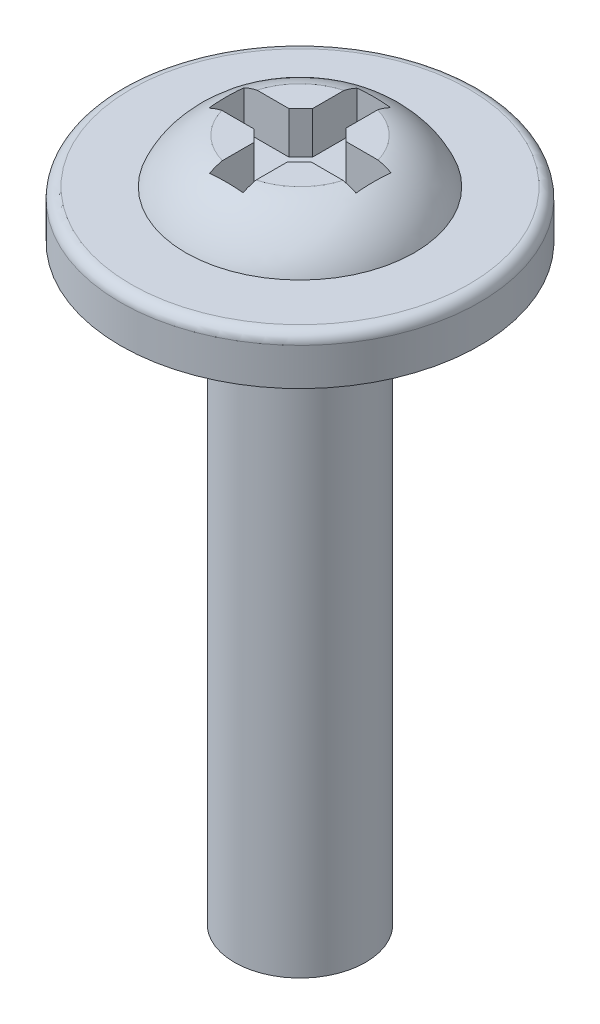
ISO-10303-21;
HEADER;
FILE_DESCRIPTION(('STEP AP214'),'2;1');
FILE_NAME('part.step','',(''),(''),'','','');
FILE_SCHEMA(('AUTOMOTIVE_DESIGN { 1 0 10303 214 1 1 1 1 }'));
ENDSEC;
DATA;
#1=APPLICATION_CONTEXT('core data for automotive mechanical design processes');
#2=APPLICATION_PROTOCOL_DEFINITION('international standard','automotive_design',2000,#1);
#3=PRODUCT_CONTEXT('',#1,'mechanical');
#4=PRODUCT('Part','Part','',(#3));
#5=PRODUCT_RELATED_PRODUCT_CATEGORY('part','',(#4));
#6=PRODUCT_DEFINITION_FORMATION('','',#4);
#7=PRODUCT_DEFINITION_CONTEXT('part definition',#1,'design');
#8=PRODUCT_DEFINITION('design','',#6,#7);
#9=PRODUCT_DEFINITION_SHAPE('','',#8);
#10=(LENGTH_UNIT() NAMED_UNIT(*) SI_UNIT(.MILLI.,.METRE.));
#11=(NAMED_UNIT(*) PLANE_ANGLE_UNIT() SI_UNIT($,.RADIAN.));
#12=(NAMED_UNIT(*) SI_UNIT($,.STERADIAN.) SOLID_ANGLE_UNIT());
#13=UNCERTAINTY_MEASURE_WITH_UNIT(LENGTH_MEASURE(1.E-05),#10,'distance_accuracy_value','');
#14=(GEOMETRIC_REPRESENTATION_CONTEXT(3) GLOBAL_UNCERTAINTY_ASSIGNED_CONTEXT((#13)) GLOBAL_UNIT_ASSIGNED_CONTEXT((#10,
#11,#12)) REPRESENTATION_CONTEXT('',''));
#15=CARTESIAN_POINT('',(0.,0.,0.));
#16=DIRECTION('',(0.,0.,1.));
#17=DIRECTION('',(1.,0.,0.));
#18=AXIS2_PLACEMENT_3D('',#15,#16,#17);
#19=CARTESIAN_POINT('',(0.,15.494,-1.905));
#20=CARTESIAN_POINT('',(0.,15.3632015750618,-2.48585998432291));
#21=CARTESIAN_POINT('',(0.,14.8318441823324,-3.16981228226771));
#22=CARTESIAN_POINT('',(0.,14.1478,-3.4544));
#23=B_SPLINE_CURVE_WITH_KNOTS('',3,(#19,#20,#21,#22),.UNSPECIFIED.,.F.,.F.,(4,4),(0.,1.),.UNSPECIFIED.);
#24=CARTESIAN_POINT('',(0.,0.,0.));
#25=DIRECTION('',(0.,-1.,0.));
#26=AXIS1_PLACEMENT('',#24,#25);
#27=SURFACE_OF_REVOLUTION('',#23,#26);
#28=CARTESIAN_POINT('',(0.,14.1478,0.));
#29=DIRECTION('',(0.,-1.,0.));
#30=DIRECTION('',(0.,0.,-1.));
#31=AXIS2_PLACEMENT_3D('',#28,#29,#30);
#32=CIRCLE('',#31,3.4544);
#33=CARTESIAN_POINT('',(0.,14.1478,-3.4544));
#34=VERTEX_POINT('',#33);
#35=EDGE_CURVE('E326',#34,#34,#32,.T.);
#36=ORIENTED_EDGE('',*,*,#35,.F.);
#37=EDGE_LOOP('',(#36));
#38=FACE_BOUND('',#37,.T.);
#39=CARTESIAN_POINT('',(-2.22356907078531,15.3579806541294,0.530600214329885));
#40=CARTESIAN_POINT('',(-2.20251859517428,15.3678587523332,0.530600214329887));
#41=CARTESIAN_POINT('',(-2.18130915061745,15.3774012520256,0.530600214329888));
#42=CARTESIAN_POINT('',(-2.13863931356944,15.3957450113185,0.530600214329889));
#43=CARTESIAN_POINT('',(-2.11717974075077,15.4045481790477,0.530600214329889));
#44=CARTESIAN_POINT('',(-2.07399660062318,15.4213837822004,0.530600214329889));
#45=CARTESIAN_POINT('',(-2.05227347592328,15.4294173501357,0.530600214329889));
#46=CARTESIAN_POINT('',(-2.00853950348615,15.444676522205,0.530600214329889));
#47=CARTESIAN_POINT('',(-1.98652859427027,15.4519019504412,0.530600214329889));
#48=CARTESIAN_POINT('',(-1.94221027994457,15.4654909301265,0.530600214329889));
#49=CARTESIAN_POINT('',(-1.91990253137907,15.471853366522,0.530600214329889));
#50=CARTESIAN_POINT('',(-1.87497312131895,15.4836498718535,0.530600214329889));
#51=CARTESIAN_POINT('',(-1.85235072870513,15.4890811509238,0.530600214329888));
#52=CARTESIAN_POINT('',(-1.82961427971938,15.494,0.530600214329888));
#53=B_SPLINE_CURVE_WITH_KNOTS('',3,(#39,#40,#41,#42,#43,#44,#45,#46,#47,#48,#49,#50,#51,#52),
.UNSPECIFIED.,.F.,.F.,(4,2,2,2,2,2,4),(0.,0.0697578375622903,0.139329720273001,
0.208797598407412,0.278280567461784,0.347852475761829,0.417629319570374),.UNSPECIFIED.);
#54=CARTESIAN_POINT('',(-2.22356907078532,15.3579806541294,0.530600214329889));
#55=VERTEX_POINT('',#54);
#56=CARTESIAN_POINT('',(-1.82961427971938,15.494,0.530600214329889));
#57=VERTEX_POINT('',#56);
#58=EDGE_CURVE('E321',#55,#57,#53,.T.);
#59=ORIENTED_EDGE('',*,*,#58,.F.);
#60=CARTESIAN_POINT('',(-2.22356907078531,15.3579806541294,0.530600214329885));
#61=CARTESIAN_POINT('',(-2.22356907078531,15.3629217206207,0.486453609451828));
#62=CARTESIAN_POINT('',(-2.22356907078532,15.3671912887825,0.442233933670321));
#63=CARTESIAN_POINT('',(-2.22356907078532,15.3744390617582,0.353789726310259));
#64=CARTESIAN_POINT('',(-2.22356907078532,15.3774201786407,0.309565434046432));
#65=CARTESIAN_POINT('',(-2.22356907078532,15.3821611274982,0.221116816199245));
#66=CARTESIAN_POINT('',(-2.22356907078532,15.3839227335333,0.176892584649752));
#67=CARTESIAN_POINT('',(-2.22356907078532,15.3862658832774,0.0884455535069007));
#68=CARTESIAN_POINT('',(-2.22356907078532,15.3868482934057,0.0442227767534489));
#69=CARTESIAN_POINT('',(-2.22356907078532,15.3868482934057,-0.0442227767534546));
#70=CARTESIAN_POINT('',(-2.22356907078532,15.3862658832774,-0.0884455535069062));
#71=CARTESIAN_POINT('',(-2.22356907078532,15.3839227335333,-0.176892584649757));
#72=CARTESIAN_POINT('',(-2.22356907078532,15.3821611274982,-0.22111681619925));
#73=CARTESIAN_POINT('',(-2.22356907078532,15.3774201786407,-0.309565434046438));
#74=CARTESIAN_POINT('',(-2.22356907078532,15.3744390617582,-0.353789726310265));
#75=CARTESIAN_POINT('',(-2.22356907078532,15.3671912887825,-0.442233933670327));
#76=CARTESIAN_POINT('',(-2.22356907078532,15.3629217206207,-0.486453609451833));
#77=CARTESIAN_POINT('',(-2.22356907078532,15.3579806541294,-0.53060021432989));
#78=B_SPLINE_CURVE_WITH_KNOTS('',3,(#60,#61,#62,#63,#64,#65,#66,#67,#68,#69,#70,#71,#72,#73,#74,
#75,#76,#77),.UNSPECIFIED.,.F.,.F.,(4,2,2,2,2,2,2,2,4),(0.,0.133258583941941,0.266214390718466,
0.398976373822808,0.531640774033104,0.6643051742434,0.797067157347742,0.930022964124267,
1.06328154806621),.UNSPECIFIED.);
#79=CARTESIAN_POINT('',(-2.22356907078532,15.3579806541294,-0.53060021432989));
#80=VERTEX_POINT('',#79);
#81=EDGE_CURVE('E452',#55,#80,#78,.T.);
#82=ORIENTED_EDGE('',*,*,#81,.T.);
#83=CARTESIAN_POINT('',(-1.82961427971938,15.494,-0.530600214329889));
#84=CARTESIAN_POINT('',(-1.85235072870513,15.4890811509238,-0.53060021432989));
#85=CARTESIAN_POINT('',(-1.87497312131895,15.4836498718535,-0.53060021432989));
#86=CARTESIAN_POINT('',(-1.91990253137907,15.471853366522,-0.53060021432989));
#87=CARTESIAN_POINT('',(-1.94221027994457,15.4654909301265,-0.53060021432989));
#88=CARTESIAN_POINT('',(-1.98652859427027,15.4519019504412,-0.53060021432989));
#89=CARTESIAN_POINT('',(-2.00853950348615,15.444676522205,-0.53060021432989));
#90=CARTESIAN_POINT('',(-2.05227347592329,15.4294173501357,-0.53060021432989));
#91=CARTESIAN_POINT('',(-2.07399660062318,15.4213837822004,-0.53060021432989));
#92=CARTESIAN_POINT('',(-2.11717974075078,15.4045481790477,-0.53060021432989));
#93=CARTESIAN_POINT('',(-2.13863931356945,15.3957450113185,-0.53060021432989));
#94=CARTESIAN_POINT('',(-2.18130915061746,15.3774012520256,-0.53060021432989));
#95=CARTESIAN_POINT('',(-2.20251859517428,15.3678587523332,-0.53060021432989));
#96=CARTESIAN_POINT('',(-2.22356907078531,15.3579806541294,-0.53060021432989));
#97=B_SPLINE_CURVE_WITH_KNOTS('',3,(#83,#84,#85,#86,#87,#88,#89,#90,#91,#92,#93,#94,#95,#96),
.UNSPECIFIED.,.F.,.F.,(4,2,2,2,2,2,4),(0.,0.0697768438085465,0.139348752108593,
0.208831721162967,0.278299599297379,0.347871482008091,0.417629319570382),.UNSPECIFIED.);
#98=CARTESIAN_POINT('',(-1.82961427971938,15.494,-0.53060021432989));
#99=VERTEX_POINT('',#98);
#100=EDGE_CURVE('E327',#99,#80,#97,.T.);
#101=ORIENTED_EDGE('',*,*,#100,.F.);
#102=CARTESIAN_POINT('',(0.,15.494,0.));
#103=DIRECTION('',(0.,-1.,0.));
#104=DIRECTION('',(0.,0.,-1.));
#105=AXIS2_PLACEMENT_3D('',#102,#103,#104);
#106=CIRCLE('',#105,1.905);
#107=CARTESIAN_POINT('',(-0.508,15.494,-1.83601770143972));
#108=VERTEX_POINT('',#107);
#109=EDGE_CURVE('E351',#99,#108,#106,.T.);
#110=ORIENTED_EDGE('',*,*,#109,.T.);
#111=CARTESIAN_POINT('',(-0.508,15.494,-1.83601770143972));
#112=CARTESIAN_POINT('',(-0.508,15.4890772866622,-1.85869246368517));
#113=CARTESIAN_POINT('',(-0.508,15.4836422043337,-1.88125275403726));
#114=CARTESIAN_POINT('',(-0.508,15.4718389300687,-1.92605738722141));
#115=CARTESIAN_POINT('',(-0.508,15.4654735312133,-1.94830246446108));
#116=CARTESIAN_POINT('',(-0.508,15.4518800967263,-1.99249509073534));
#117=CARTESIAN_POINT('',(-0.508,15.4446531747896,-2.01444298391082));
#118=CARTESIAN_POINT('',(-0.508,15.4293929072072,-2.0580506972434));
#119=CARTESIAN_POINT('',(-0.508,15.4213597390474,-2.07971057961896));
#120=CARTESIAN_POINT('',(-0.508,15.4045270887022,-2.12276723828017));
#121=CARTESIAN_POINT('',(-0.508,15.3957264749622,-2.14416357110202));
#122=CARTESIAN_POINT('',(-0.508,15.3773901687989,-2.18670705080968));
#123=CARTESIAN_POINT('',(-0.508,15.3678525726132,-2.20785337780709));
#124=CARTESIAN_POINT('',(-0.508,15.3579806541294,-2.22884095439759));
#125=B_SPLINE_CURVE_WITH_KNOTS('',3,(#111,#112,#113,#114,#115,#116,#117,#118,#119,#120,#121,
#122,#123,#124),.UNSPECIFIED.,.F.,.F.,(4,2,2,2,2,2,4),(0.,0.0695983658431737,0.138991913436484,
0.208296709070973,0.277586281379517,0.34697980281484,0.416558992350354),.UNSPECIFIED.);
#126=CARTESIAN_POINT('',(-0.508,15.3579806541294,-2.2288409543976));
#127=VERTEX_POINT('',#126);
#128=EDGE_CURVE('E415',#108,#127,#125,.T.);
#129=ORIENTED_EDGE('',*,*,#128,.T.);
#130=CARTESIAN_POINT('',(0.508000000000002,15.3579806541294,-2.22884095439759));
#131=CARTESIAN_POINT('',(0.465727683927626,15.3625105562352,-2.22884095439759));
#132=CARTESIAN_POINT('',(0.423391520364505,15.3664290641181,-2.2288409543976));
#133=CARTESIAN_POINT('',(0.338715286841423,15.3730865747813,-2.2288409543976));
#134=CARTESIAN_POINT('',(0.296375409730574,15.3758280240421,-2.2288409543976));
#135=CARTESIAN_POINT('',(0.211695632434225,15.3801902643877,-2.2288409543976));
#136=CARTESIAN_POINT('',(0.169355808841702,15.3818125574861,-2.2288409543976));
#137=CARTESIAN_POINT('',(0.0846773110622564,15.3839708839213,-2.2288409543976));
#138=CARTESIAN_POINT('',(0.0423386555311298,15.3845076524597,-2.2288409543976));
#139=CARTESIAN_POINT('',(-0.0423386555311236,15.3845076524598,-2.2288409543976));
#140=CARTESIAN_POINT('',(-0.0846773110622504,15.3839708839213,-2.2288409543976));
#141=CARTESIAN_POINT('',(-0.169355808841696,15.3818125574861,-2.2288409543976));
#142=CARTESIAN_POINT('',(-0.211695632434219,15.3801902643877,-2.2288409543976));
#143=CARTESIAN_POINT('',(-0.296375409730568,15.3758280240421,-2.2288409543976));
#144=CARTESIAN_POINT('',(-0.338715286841417,15.3730865747813,-2.2288409543976));
#145=CARTESIAN_POINT('',(-0.4233915203645,15.3664290641181,-2.2288409543976));
#146=CARTESIAN_POINT('',(-0.46572768392762,15.3625105562352,-2.2288409543976));
#147=CARTESIAN_POINT('',(-0.507999999999994,15.3579806541294,-2.2288409543976));
#148=B_SPLINE_CURVE_WITH_KNOTS('',3,(#130,#131,#132,#133,#134,#135,#136,#137,#138,#139,#140,
#141,#142,#143,#144,#145,#146,#147),.UNSPECIFIED.,.F.,.F.,(4,2,2,2,2,2,2,2,4),(0.,
0.127536118282588,0.254805858077294,0.381904455774846,0.50891694354961,0.635929431324374,
0.763028029021926,0.890297768816631,1.01783388709922),.UNSPECIFIED.);
#149=CARTESIAN_POINT('',(0.508,15.3579806541294,-2.2288409543976));
#150=VERTEX_POINT('',#149);
#151=EDGE_CURVE('E378',#150,#127,#148,.T.);
#152=ORIENTED_EDGE('',*,*,#151,.F.);
#153=CARTESIAN_POINT('',(0.508000000000002,15.3579806541294,-2.22884095439759));
#154=CARTESIAN_POINT('',(0.508000000000001,15.3678525726132,-2.20785337780708));
#155=CARTESIAN_POINT('',(0.508,15.3773901687989,-2.18670705080967));
#156=CARTESIAN_POINT('',(0.508,15.3957264749622,-2.14416357110202));
#157=CARTESIAN_POINT('',(0.508,15.4045270887022,-2.12276723828016));
#158=CARTESIAN_POINT('',(0.508,15.4213597390474,-2.07971057961895));
#159=CARTESIAN_POINT('',(0.508,15.4293929072072,-2.0580506972434));
#160=CARTESIAN_POINT('',(0.508,15.4446531747896,-2.01444298391082));
#161=CARTESIAN_POINT('',(0.508,15.4518800967263,-1.99249509073534));
#162=CARTESIAN_POINT('',(0.508,15.4654735312133,-1.94830246446108));
#163=CARTESIAN_POINT('',(0.508,15.4718389300687,-1.92605738722141));
#164=CARTESIAN_POINT('',(0.508,15.4836422043337,-1.88125275403726));
#165=CARTESIAN_POINT('',(0.508,15.4890772866622,-1.85869246368517));
#166=CARTESIAN_POINT('',(0.508,15.494,-1.83601770143972));
#167=B_SPLINE_CURVE_WITH_KNOTS('',3,(#153,#154,#155,#156,#157,#158,#159,#160,#161,#162,#163,
#164,#165,#166),.UNSPECIFIED.,.F.,.F.,(4,2,2,2,2,2,4),(0.,0.0695791895355102,0.138972710970831,
0.208262283279374,0.277567078913863,0.346960626507172,0.416558992350344),.UNSPECIFIED.);
#168=CARTESIAN_POINT('',(0.508,15.494,-1.83601770143972));
#169=VERTEX_POINT('',#168);
#170=EDGE_CURVE('E409',#150,#169,#167,.T.);
#171=ORIENTED_EDGE('',*,*,#170,.T.);
#172=CARTESIAN_POINT('',(1.82961427971938,15.494,-0.53060021432989));
#173=VERTEX_POINT('',#172);
#174=EDGE_CURVE('E352',#169,#173,#106,.T.);
#175=ORIENTED_EDGE('',*,*,#174,.T.);
#176=CARTESIAN_POINT('',(2.22356907078532,15.3579806541294,-0.53060021432989));
#177=CARTESIAN_POINT('',(2.20251859517428,15.3678587523332,-0.53060021432989));
#178=CARTESIAN_POINT('',(2.18130915061746,15.3774012520256,-0.53060021432989));
#179=CARTESIAN_POINT('',(2.13863931356945,15.3957450113185,-0.53060021432989));
#180=CARTESIAN_POINT('',(2.11717974075078,15.4045481790477,-0.53060021432989));
#181=CARTESIAN_POINT('',(2.07399660062318,15.4213837822004,-0.53060021432989));
#182=CARTESIAN_POINT('',(2.05227347592329,15.4294173501357,-0.53060021432989));
#183=CARTESIAN_POINT('',(2.00853950348615,15.444676522205,-0.53060021432989));
#184=CARTESIAN_POINT('',(1.98652859427028,15.4519019504412,-0.53060021432989));
#185=CARTESIAN_POINT('',(1.94221027994457,15.4654909301265,-0.53060021432989));
#186=CARTESIAN_POINT('',(1.91990253137907,15.471853366522,-0.53060021432989));
#187=CARTESIAN_POINT('',(1.87497312131895,15.4836498718535,-0.53060021432989));
#188=CARTESIAN_POINT('',(1.85235072870513,15.4890811509238,-0.53060021432989));
#189=CARTESIAN_POINT('',(1.82961427971938,15.494,-0.53060021432989));
#190=B_SPLINE_CURVE_WITH_KNOTS('',3,(#176,#177,#178,#179,#180,#181,#182,#183,#184,#185,#186,
#187,#188,#189),.UNSPECIFIED.,.F.,.F.,(4,2,2,2,2,2,4),(0.,0.0697578375622914,0.139329720273005,
0.208797598407417,0.278280567461791,0.347852475761837,0.417629319570385),.UNSPECIFIED.);
#191=CARTESIAN_POINT('',(2.22356907078532,15.3579806541294,-0.53060021432989));
#192=VERTEX_POINT('',#191);
#193=EDGE_CURVE('E404',#192,#173,#190,.T.);
#194=ORIENTED_EDGE('',*,*,#193,.F.);
#195=CARTESIAN_POINT('',(2.22356907078531,15.3579806541294,0.530600214329891));
#196=CARTESIAN_POINT('',(2.22356907078532,15.3629217206207,0.486453609451833));
#197=CARTESIAN_POINT('',(2.22356907078532,15.3671912887825,0.442233933670326));
#198=CARTESIAN_POINT('',(2.22356907078532,15.3744390617582,0.353789726310263));
#199=CARTESIAN_POINT('',(2.22356907078532,15.3774201786407,0.309565434046436));
#200=CARTESIAN_POINT('',(2.22356907078532,15.3821611274982,0.221116816199248));
#201=CARTESIAN_POINT('',(2.22356907078532,15.3839227335333,0.176892584649755));
#202=CARTESIAN_POINT('',(2.22356907078532,15.3862658832774,0.0884455535069037));
#203=CARTESIAN_POINT('',(2.22356907078532,15.3868482934057,0.0442227767534516));
#204=CARTESIAN_POINT('',(2.22356907078532,15.3868482934057,-0.0442227767534523));
#205=CARTESIAN_POINT('',(2.22356907078532,15.3862658832774,-0.0884455535069043));
#206=CARTESIAN_POINT('',(2.22356907078532,15.3839227335333,-0.176892584649756));
#207=CARTESIAN_POINT('',(2.22356907078532,15.3821611274982,-0.221116816199249));
#208=CARTESIAN_POINT('',(2.22356907078532,15.3774201786407,-0.309565434046437));
#209=CARTESIAN_POINT('',(2.22356907078532,15.3744390617582,-0.353789726310264));
#210=CARTESIAN_POINT('',(2.22356907078532,15.3671912887825,-0.442233933670327));
#211=CARTESIAN_POINT('',(2.22356907078532,15.3629217206207,-0.486453609451833));
#212=CARTESIAN_POINT('',(2.22356907078532,15.3579806541294,-0.530600214329891));
#213=B_SPLINE_CURVE_WITH_KNOTS('',3,(#195,#196,#197,#198,#199,#200,#201,#202,#203,#204,#205,
#206,#207,#208,#209,#210,#211,#212),.UNSPECIFIED.,.F.,.F.,(4,2,2,2,2,2,2,2,4),(0.,
0.133258583941942,0.266214390718467,0.39897637382281,0.531640774033107,0.664305174243404,
0.797067157347747,0.930022964124273,1.06328154806621),.UNSPECIFIED.);
#214=CARTESIAN_POINT('',(2.22356907078532,15.3579806541294,0.530600214329889));
#215=VERTEX_POINT('',#214);
#216=EDGE_CURVE('E372',#215,#192,#213,.T.);
#217=ORIENTED_EDGE('',*,*,#216,.F.);
#218=CARTESIAN_POINT('',(1.82961427971938,15.494,0.530600214329889));
#219=CARTESIAN_POINT('',(1.85235072870513,15.4890811509238,0.530600214329889));
#220=CARTESIAN_POINT('',(1.87497312131895,15.4836498718535,0.530600214329889));
#221=CARTESIAN_POINT('',(1.91990253137907,15.471853366522,0.530600214329889));
#222=CARTESIAN_POINT('',(1.94221027994457,15.4654909301265,0.530600214329889));
#223=CARTESIAN_POINT('',(1.98652859427027,15.4519019504412,0.530600214329889));
#224=CARTESIAN_POINT('',(2.00853950348615,15.444676522205,0.530600214329889));
#225=CARTESIAN_POINT('',(2.05227347592329,15.4294173501357,0.530600214329889));
#226=CARTESIAN_POINT('',(2.07399660062318,15.4213837822004,0.530600214329889));
#227=CARTESIAN_POINT('',(2.11717974075077,15.4045481790477,0.530600214329889));
#228=CARTESIAN_POINT('',(2.13863931356945,15.3957450113185,0.530600214329889));
#229=CARTESIAN_POINT('',(2.18130915061746,15.3774012520256,0.530600214329889));
#230=CARTESIAN_POINT('',(2.20251859517428,15.3678587523332,0.530600214329889));
#231=CARTESIAN_POINT('',(2.22356907078531,15.3579806541294,0.530600214329888));
#232=B_SPLINE_CURVE_WITH_KNOTS('',3,(#218,#219,#220,#221,#222,#223,#224,#225,#226,#227,#228,
#229,#230,#231),.UNSPECIFIED.,.F.,.F.,(4,2,2,2,2,2,4),(0.,0.0697768438085463,0.139348752108592,
0.208831721162967,0.278299599297378,0.34787148200809,0.417629319570382),.UNSPECIFIED.);
#233=CARTESIAN_POINT('',(1.82961427971938,15.494,0.530600214329889));
#234=VERTEX_POINT('',#233);
#235=EDGE_CURVE('E399',#234,#215,#232,.T.);
#236=ORIENTED_EDGE('',*,*,#235,.F.);
#237=CARTESIAN_POINT('',(0.508,15.494,1.83601770143972));
#238=VERTEX_POINT('',#237);
#239=EDGE_CURVE('E356',#234,#238,#106,.T.);
#240=ORIENTED_EDGE('',*,*,#239,.T.);
#241=CARTESIAN_POINT('',(0.508,15.494,1.83601770143972));
#242=CARTESIAN_POINT('',(0.508,15.4890772866622,1.85869246368517));
#243=CARTESIAN_POINT('',(0.508,15.4836422043337,1.88125275403727));
#244=CARTESIAN_POINT('',(0.508,15.4718389300687,1.92605738722141));
#245=CARTESIAN_POINT('',(0.508,15.4654735312133,1.94830246446108));
#246=CARTESIAN_POINT('',(0.508,15.4518800967263,1.99249509073535));
#247=CARTESIAN_POINT('',(0.508,15.4446531747896,2.01444298391083));
#248=CARTESIAN_POINT('',(0.508,15.4293929072072,2.05805069724341));
#249=CARTESIAN_POINT('',(0.508,15.4213597390474,2.07971057961897));
#250=CARTESIAN_POINT('',(0.508,15.4045270887022,2.12276723828018));
#251=CARTESIAN_POINT('',(0.508,15.3957264749622,2.14416357110203));
#252=CARTESIAN_POINT('',(0.508,15.3773901687989,2.18670705080969));
#253=CARTESIAN_POINT('',(0.508,15.3678525726132,2.20785337780709));
#254=CARTESIAN_POINT('',(0.508,15.3579806541294,2.2288409543976));
#255=B_SPLINE_CURVE_WITH_KNOTS('',3,(#241,#242,#243,#244,#245,#246,#247,#248,#249,#250,#251,
#252,#253,#254),.UNSPECIFIED.,.F.,.F.,(4,2,2,2,2,2,4),(0.,0.0695983658431761,0.138991913436488,
0.20829670907098,0.277586281379526,0.346979802814851,0.416558992350367),.UNSPECIFIED.);
#256=CARTESIAN_POINT('',(0.508,15.3579806541294,2.2288409543976));
#257=VERTEX_POINT('',#256);
#258=EDGE_CURVE('E292',#238,#257,#255,.T.);
#259=ORIENTED_EDGE('',*,*,#258,.T.);
#260=CARTESIAN_POINT('',(0.508,15.3579806541294,2.2288409543976));
#261=CARTESIAN_POINT('',(0.465727683927625,15.3625105562352,2.2288409543976));
#262=CARTESIAN_POINT('',(0.423391520364505,15.3664290641181,2.2288409543976));
#263=CARTESIAN_POINT('',(0.338715286841422,15.3730865747813,2.2288409543976));
#264=CARTESIAN_POINT('',(0.296375409730572,15.3758280240421,2.2288409543976));
#265=CARTESIAN_POINT('',(0.211695632434223,15.3801902643877,2.2288409543976));
#266=CARTESIAN_POINT('',(0.1693558088417,15.3818125574861,2.2288409543976));
#267=CARTESIAN_POINT('',(0.084677311062254,15.3839708839213,2.2288409543976));
#268=CARTESIAN_POINT('',(0.0423386555311271,15.3845076524597,2.2288409543976));
#269=CARTESIAN_POINT('',(-0.0423386555311267,15.3845076524597,2.2288409543976));
#270=CARTESIAN_POINT('',(-0.0846773110622536,15.3839708839213,2.2288409543976));
#271=CARTESIAN_POINT('',(-0.1693558088417,15.3818125574861,2.2288409543976));
#272=CARTESIAN_POINT('',(-0.211695632434222,15.3801902643877,2.2288409543976));
#273=CARTESIAN_POINT('',(-0.296375409730572,15.3758280240421,2.2288409543976));
#274=CARTESIAN_POINT('',(-0.338715286841421,15.3730865747813,2.2288409543976));
#275=CARTESIAN_POINT('',(-0.423391520364504,15.3664290641181,2.2288409543976));
#276=CARTESIAN_POINT('',(-0.465727683927625,15.3625105562352,2.2288409543976));
#277=CARTESIAN_POINT('',(-0.508,15.3579806541294,2.2288409543976));
#278=B_SPLINE_CURVE_WITH_KNOTS('',3,(#260,#261,#262,#263,#264,#265,#266,#267,#268,#269,#270,
#271,#272,#273,#274,#275,#276,#277),.UNSPECIFIED.,.F.,.F.,(4,2,2,2,2,2,2,2,4),(0.,
0.127536118282589,0.254805858077296,0.381904455774849,0.508916943549613,0.635929431324377,
0.76302802902193,0.890297768816636,1.01783388709923),.UNSPECIFIED.);
#279=CARTESIAN_POINT('',(-0.508,15.3579806541294,2.2288409543976));
#280=VERTEX_POINT('',#279);
#281=EDGE_CURVE('E366',#257,#280,#278,.T.);
#282=ORIENTED_EDGE('',*,*,#281,.T.);
#283=CARTESIAN_POINT('',(-0.508,15.3579806541294,2.2288409543976));
#284=CARTESIAN_POINT('',(-0.508,15.3678525726132,2.2078533778071));
#285=CARTESIAN_POINT('',(-0.508,15.3773901687989,2.18670705080969));
#286=CARTESIAN_POINT('',(-0.508,15.3957264749622,2.14416357110203));
#287=CARTESIAN_POINT('',(-0.508,15.4045270887022,2.12276723828017));
#288=CARTESIAN_POINT('',(-0.508,15.4213597390474,2.07971057961896));
#289=CARTESIAN_POINT('',(-0.508,15.4293929072072,2.05805069724341));
#290=CARTESIAN_POINT('',(-0.508,15.4446531747896,2.01444298391083));
#291=CARTESIAN_POINT('',(-0.508,15.4518800967263,1.99249509073535));
#292=CARTESIAN_POINT('',(-0.508,15.4654735312133,1.94830246446108));
#293=CARTESIAN_POINT('',(-0.508,15.4718389300687,1.92605738722141));
#294=CARTESIAN_POINT('',(-0.508,15.4836422043337,1.88125275403727));
#295=CARTESIAN_POINT('',(-0.508,15.4890772866622,1.85869246368517));
#296=CARTESIAN_POINT('',(-0.508,15.494,1.83601770143972));
#297=B_SPLINE_CURVE_WITH_KNOTS('',3,(#283,#284,#285,#286,#287,#288,#289,#290,#291,#292,#293,
#294,#295,#296),.UNSPECIFIED.,.F.,.F.,(4,2,2,2,2,2,4),(0.,0.0695791895355156,0.138972710970841,
0.208262283279386,0.277567078913878,0.34696062650719,0.416558992350366),.UNSPECIFIED.);
#298=CARTESIAN_POINT('',(-0.508,15.494,1.83601770143972));
#299=VERTEX_POINT('',#298);
#300=EDGE_CURVE('E249',#280,#299,#297,.T.);
#301=ORIENTED_EDGE('',*,*,#300,.T.);
#302=EDGE_CURVE('E454',#299,#57,#106,.T.);
#303=ORIENTED_EDGE('',*,*,#302,.T.);
#304=EDGE_LOOP('',(#59,#82,#101,#110,#129,#152,#171,#175,#194,#217,#236,#240,#259,#282,#301,#303));
#305=FACE_BOUND('',#304,.T.);
#306=ADVANCED_FACE('F37',(#38,#305),#27,.T.);
#307=CARTESIAN_POINT('',(0.,15.494,0.));
#308=DIRECTION('',(0.,-1.,0.));
#309=DIRECTION('',(0.,0.,-1.));
#310=AXIS2_PLACEMENT_3D('',#307,#308,#309);
#311=PLANE('',#310);
#312=DIRECTION('',(-1.,0.,0.));
#313=VECTOR('',#312,1.);
#314=CARTESIAN_POINT('',(0.,15.494,-0.53060021432989));
#315=LINE('',#314,#313);
#316=CARTESIAN_POINT('',(-0.861964761186199,15.494,-0.53060021432989));
#317=VERTEX_POINT('',#316);
#318=EDGE_CURVE('E364',#317,#99,#315,.T.);
#319=ORIENTED_EDGE('',*,*,#318,.F.);
#320=DIRECTION('',(0.707106781186539,0.,-0.707106781186557));
#321=VECTOR('',#320,1.);
#322=CARTESIAN_POINT('',(-0.696282487758055,15.494,-0.696282487758038));
#323=LINE('',#322,#321);
#324=CARTESIAN_POINT('',(-0.508,15.494,-0.884564975516098));
#325=VERTEX_POINT('',#324);
#326=EDGE_CURVE('E196',#317,#325,#323,.T.);
#327=ORIENTED_EDGE('',*,*,#326,.T.);
#328=DIRECTION('',(0.,0.,-1.));
#329=VECTOR('',#328,1.);
#330=CARTESIAN_POINT('',(-0.508,15.494,0.));
#331=LINE('',#330,#329);
#332=EDGE_CURVE('E361',#325,#108,#331,.T.);
#333=ORIENTED_EDGE('',*,*,#332,.T.);
#334=ORIENTED_EDGE('',*,*,#109,.F.);
#335=EDGE_LOOP('',(#319,#327,#333,#334));
#336=FACE_BOUND('',#335,.T.);
#337=ADVANCED_FACE('F438',(#336),#311,.F.);
#338=DIRECTION('',(1.,0.,0.));
#339=VECTOR('',#338,1.);
#340=CARTESIAN_POINT('',(0.,15.494,0.530600214329889));
#341=LINE('',#340,#339);
#342=CARTESIAN_POINT('',(0.861964761186181,15.494,0.530600214329889));
#343=VERTEX_POINT('',#342);
#344=EDGE_CURVE('E359',#343,#234,#341,.T.);
#345=ORIENTED_EDGE('',*,*,#344,.F.);
#346=DIRECTION('',(-0.707106781186539,0.,0.707106781186556));
#347=VECTOR('',#346,1.);
#348=CARTESIAN_POINT('',(0.696282487758045,15.494,0.696282487758028));
#349=LINE('',#348,#347);
#350=CARTESIAN_POINT('',(0.508,15.494,0.884564975516078));
#351=VERTEX_POINT('',#350);
#352=EDGE_CURVE('E237',#343,#351,#349,.T.);
#353=ORIENTED_EDGE('',*,*,#352,.T.);
#354=DIRECTION('',(0.,0.,1.));
#355=VECTOR('',#354,1.);
#356=CARTESIAN_POINT('',(0.508,15.494,0.));
#357=LINE('',#356,#355);
#358=EDGE_CURVE('E355',#351,#238,#357,.T.);
#359=ORIENTED_EDGE('',*,*,#358,.T.);
#360=ORIENTED_EDGE('',*,*,#239,.F.);
#361=EDGE_LOOP('',(#345,#353,#359,#360));
#362=FACE_BOUND('',#361,.T.);
#363=ADVANCED_FACE('F443',(#362),#311,.F.);
#364=DIRECTION('',(-1.,0.,0.));
#365=VECTOR('',#364,1.);
#366=CARTESIAN_POINT('',(0.,15.494,0.530600214329888));
#367=LINE('',#366,#365);
#368=CARTESIAN_POINT('',(-0.861964761186199,15.494,0.530600214329889));
#369=VERTEX_POINT('',#368);
#370=EDGE_CURVE('E52',#369,#57,#367,.T.);
#371=ORIENTED_EDGE('',*,*,#370,.T.);
#372=ORIENTED_EDGE('',*,*,#302,.F.);
#373=DIRECTION('',(0.,0.,1.));
#374=VECTOR('',#373,1.);
#375=CARTESIAN_POINT('',(-0.508,15.494,0.));
#376=LINE('',#375,#374);
#377=CARTESIAN_POINT('',(-0.508,15.494,0.884564975516078));
#378=VERTEX_POINT('',#377);
#379=EDGE_CURVE('E235',#378,#299,#376,.T.);
#380=ORIENTED_EDGE('',*,*,#379,.F.);
#381=DIRECTION('',(-0.707106781186557,0.,-0.707106781186539));
#382=VECTOR('',#381,1.);
#383=CARTESIAN_POINT('',(-0.696282487758033,15.494,0.696282487758051));
#384=LINE('',#383,#382);
#385=EDGE_CURVE('E233',#378,#369,#384,.T.);
#386=ORIENTED_EDGE('',*,*,#385,.T.);
#387=EDGE_LOOP('',(#371,#372,#380,#386));
#388=FACE_BOUND('',#387,.T.);
#389=ADVANCED_FACE('F456',(#388),#311,.F.);
#390=ORIENTED_EDGE('',*,*,#174,.F.);
#391=DIRECTION('',(0.,0.,-1.));
#392=VECTOR('',#391,1.);
#393=CARTESIAN_POINT('',(0.508,15.494,0.));
#394=LINE('',#393,#392);
#395=CARTESIAN_POINT('',(0.508,15.494,-0.884564975516098));
#396=VERTEX_POINT('',#395);
#397=EDGE_CURVE('E199',#396,#169,#394,.T.);
#398=ORIENTED_EDGE('',*,*,#397,.F.);
#399=DIRECTION('',(0.707106781186556,0.,0.707106781186539));
#400=VECTOR('',#399,1.);
#401=CARTESIAN_POINT('',(0.696282487758043,15.494,-0.69628248775806));
#402=LINE('',#401,#400);
#403=CARTESIAN_POINT('',(0.861964761186216,15.494,-0.53060021432989));
#404=VERTEX_POINT('',#403);
#405=EDGE_CURVE('E243',#396,#404,#402,.T.);
#406=ORIENTED_EDGE('',*,*,#405,.T.);
#407=DIRECTION('',(1.,0.,0.));
#408=VECTOR('',#407,1.);
#409=CARTESIAN_POINT('',(0.,15.494,-0.53060021432989));
#410=LINE('',#409,#408);
#411=EDGE_CURVE('E240',#404,#173,#410,.T.);
#412=ORIENTED_EDGE('',*,*,#411,.T.);
#413=EDGE_LOOP('',(#390,#398,#406,#412));
#414=FACE_BOUND('',#413,.T.);
#415=ADVANCED_FACE('F445',(#414),#311,.F.);
#416=CARTESIAN_POINT('',(0.,-5.15261801381829,0.));
#417=DIRECTION('',(0.,1.,0.));
#418=DIRECTION('',(0.,0.,1.));
#419=AXIS2_PLACEMENT_3D('',#416,#417,#418);
#420=CONICAL_SURFACE('',#419,1.9812,1.02716825384943);
#421=CARTESIAN_POINT('',(0.,-6.35,0.));
#422=VERTEX_POINT('',#421);
#423=VERTEX_LOOP('',#422);
#424=FACE_BOUND('',#423,.T.);
#425=CARTESIAN_POINT('',(0.,-5.15261801381829,0.));
#426=DIRECTION('',(0.,-1.,0.));
#427=DIRECTION('',(0.,0.,-1.));
#428=AXIS2_PLACEMENT_3D('',#425,#426,#427);
#429=CIRCLE('',#428,1.9812);
#430=CARTESIAN_POINT('',(0.,-5.15261801381829,-1.9812));
#431=VERTEX_POINT('',#430);
#432=EDGE_CURVE('E348',#431,#431,#429,.T.);
#433=ORIENTED_EDGE('',*,*,#432,.T.);
#434=EDGE_LOOP('',(#433));
#435=FACE_BOUND('',#434,.T.);
#436=ADVANCED_FACE('F524',(#424,#435),#420,.T.);
#437=CARTESIAN_POINT('',(0.,0.,0.));
#438=DIRECTION('',(0.,-1.,0.));
#439=DIRECTION('',(0.,0.,-1.));
#440=AXIS2_PLACEMENT_3D('',#437,#438,#439);
#441=CYLINDRICAL_SURFACE('',#440,1.9812);
#442=CARTESIAN_POINT('',(0.,12.7,0.));
#443=DIRECTION('',(0.,-1.,0.));
#444=DIRECTION('',(0.,0.,-1.));
#445=AXIS2_PLACEMENT_3D('',#442,#443,#444);
#446=CIRCLE('',#445,1.9812);
#447=CARTESIAN_POINT('',(0.,12.7,-1.9812));
#448=VERTEX_POINT('',#447);
#449=EDGE_CURVE('E345',#448,#448,#446,.T.);
#450=ORIENTED_EDGE('',*,*,#449,.T.);
#451=EDGE_LOOP('',(#450));
#452=FACE_BOUND('',#451,.T.);
#453=ORIENTED_EDGE('',*,*,#432,.F.);
#454=EDGE_LOOP('',(#453));
#455=FACE_BOUND('',#454,.T.);
#456=ADVANCED_FACE('F527',(#452,#455),#441,.T.);
#457=CARTESIAN_POINT('',(0.,12.7,0.));
#458=DIRECTION('',(0.,-1.,0.));
#459=DIRECTION('',(0.,0.,-1.));
#460=AXIS2_PLACEMENT_3D('',#457,#458,#459);
#461=PLANE('',#460);
#462=CARTESIAN_POINT('',(0.,12.7,0.));
#463=DIRECTION('',(0.,-1.,0.));
#464=DIRECTION('',(0.,0.,-1.));
#465=AXIS2_PLACEMENT_3D('',#462,#463,#464);
#466=CIRCLE('',#465,5.4229);
#467=CARTESIAN_POINT('',(0.,12.7,-5.4229));
#468=VERTEX_POINT('',#467);
#469=EDGE_CURVE('E342',#468,#468,#466,.T.);
#470=ORIENTED_EDGE('',*,*,#469,.T.);
#471=EDGE_LOOP('',(#470));
#472=FACE_BOUND('',#471,.T.);
#473=ORIENTED_EDGE('',*,*,#449,.F.);
#474=EDGE_LOOP('',(#473));
#475=FACE_BOUND('',#474,.T.);
#476=ADVANCED_FACE('F530',(#472,#475),#461,.T.);
#477=CARTESIAN_POINT('',(0.,0.,0.));
#478=DIRECTION('',(0.,-1.,0.));
#479=DIRECTION('',(0.,0.,-1.));
#480=AXIS2_PLACEMENT_3D('',#477,#478,#479);
#481=CYLINDRICAL_SURFACE('',#480,5.4229);
#482=CARTESIAN_POINT('',(0.,13.8303,0.));
#483=DIRECTION('',(0.,-1.,0.));
#484=DIRECTION('',(0.,0.,-1.));
#485=AXIS2_PLACEMENT_3D('',#482,#483,#484);
#486=CIRCLE('',#485,5.4229);
#487=CARTESIAN_POINT('',(0.,13.8303,-5.4229));
#488=VERTEX_POINT('',#487);
#489=EDGE_CURVE('E45',#488,#488,#486,.T.);
#490=ORIENTED_EDGE('',*,*,#489,.T.);
#491=EDGE_LOOP('',(#490));
#492=FACE_BOUND('',#491,.T.);
#493=ORIENTED_EDGE('',*,*,#469,.F.);
#494=EDGE_LOOP('',(#493));
#495=FACE_BOUND('',#494,.T.);
#496=ADVANCED_FACE('F533',(#492,#495),#481,.T.);
#497=CARTESIAN_POINT('',(0.,14.1478,0.));
#498=DIRECTION('',(0.,-1.,0.));
#499=DIRECTION('',(0.,0.,-1.));
#500=AXIS2_PLACEMENT_3D('',#497,#498,#499);
#501=PLANE('',#500);
#502=CARTESIAN_POINT('',(0.,14.1478,0.));
#503=DIRECTION('',(0.,-1.,0.));
#504=DIRECTION('',(0.,0.,-1.));
#505=AXIS2_PLACEMENT_3D('',#502,#503,#504);
#506=CIRCLE('',#505,5.1054);
#507=CARTESIAN_POINT('',(0.,14.1478,-5.1054));
#508=VERTEX_POINT('',#507);
#509=EDGE_CURVE('E11',#508,#508,#506,.F.);
#510=ORIENTED_EDGE('',*,*,#509,.T.);
#511=EDGE_LOOP('',(#510));
#512=FACE_BOUND('',#511,.T.);
#513=ORIENTED_EDGE('',*,*,#35,.T.);
#514=EDGE_LOOP('',(#513));
#515=FACE_BOUND('',#514,.T.);
#516=ADVANCED_FACE('F318',(#512,#515),#501,.F.);
#517=CARTESIAN_POINT('',(-2.22356907078532,14.224,0.));
#518=DIRECTION('',(-1.,0.,0.));
#519=DIRECTION('',(0.,0.,1.));
#520=AXIS2_PLACEMENT_3D('',#517,#518,#519);
#521=PLANE('',#520);
#522=DIRECTION('',(0.,1.,0.));
#523=VECTOR('',#522,1.);
#524=CARTESIAN_POINT('',(-2.22356907078532,14.224,0.530600214329889));
#525=LINE('',#524,#523);
#526=CARTESIAN_POINT('',(-2.22356907078532,14.224,0.530600214329889));
#527=VERTEX_POINT('',#526);
#528=EDGE_CURVE('E247',#527,#55,#525,.T.);
#529=ORIENTED_EDGE('',*,*,#528,.F.);
#530=DIRECTION('',(0.,0.,1.));
#531=VECTOR('',#530,1.);
#532=CARTESIAN_POINT('',(-2.22356907078532,14.224,0.));
#533=LINE('',#532,#531);
#534=CARTESIAN_POINT('',(-2.22356907078532,14.224,-0.53060021432989));
#535=VERTEX_POINT('',#534);
#536=EDGE_CURVE('E190',#535,#527,#533,.T.);
#537=ORIENTED_EDGE('',*,*,#536,.F.);
#538=DIRECTION('',(0.,1.,0.));
#539=VECTOR('',#538,1.);
#540=CARTESIAN_POINT('',(-2.22356907078532,14.224,-0.53060021432989));
#541=LINE('',#540,#539);
#542=EDGE_CURVE('E250',#535,#80,#541,.T.);
#543=ORIENTED_EDGE('',*,*,#542,.T.);
#544=ORIENTED_EDGE('',*,*,#81,.F.);
#545=EDGE_LOOP('',(#529,#537,#543,#544));
#546=FACE_BOUND('',#545,.T.);
#547=ADVANCED_FACE('F497',(#546),#521,.F.);
#548=CARTESIAN_POINT('',(0.,14.224,-2.2288409543976));
#549=DIRECTION('',(0.,0.,1.));
#550=DIRECTION('',(1.,0.,0.));
#551=AXIS2_PLACEMENT_3D('',#548,#549,#550);
#552=PLANE('',#551);
#553=ORIENTED_EDGE('',*,*,#151,.T.);
#554=DIRECTION('',(0.,1.,0.));
#555=VECTOR('',#554,1.);
#556=CARTESIAN_POINT('',(-0.508,14.224,-2.2288409543976));
#557=LINE('',#556,#555);
#558=CARTESIAN_POINT('',(-0.508,14.224,-2.2288409543976));
#559=VERTEX_POINT('',#558);
#560=EDGE_CURVE('E258',#559,#127,#557,.T.);
#561=ORIENTED_EDGE('',*,*,#560,.F.);
#562=DIRECTION('',(1.,0.,0.));
#563=VECTOR('',#562,1.);
#564=CARTESIAN_POINT('',(0.,14.224,-2.2288409543976));
#565=LINE('',#564,#563);
#566=CARTESIAN_POINT('',(0.508,14.224,-2.2288409543976));
#567=VERTEX_POINT('',#566);
#568=EDGE_CURVE('E222',#559,#567,#565,.T.);
#569=ORIENTED_EDGE('',*,*,#568,.T.);
#570=DIRECTION('',(0.,1.,0.));
#571=VECTOR('',#570,1.);
#572=CARTESIAN_POINT('',(0.508,14.224,-2.2288409543976));
#573=LINE('',#572,#571);
#574=EDGE_CURVE('E261',#567,#150,#573,.T.);
#575=ORIENTED_EDGE('',*,*,#574,.T.);
#576=EDGE_LOOP('',(#553,#561,#569,#575));
#577=FACE_BOUND('',#576,.T.);
#578=ADVANCED_FACE('F389',(#577),#552,.T.);
#579=CARTESIAN_POINT('',(2.22356907078532,14.224,0.));
#580=DIRECTION('',(-1.,0.,0.));
#581=DIRECTION('',(0.,0.,1.));
#582=AXIS2_PLACEMENT_3D('',#579,#580,#581);
#583=PLANE('',#582);
#584=ORIENTED_EDGE('',*,*,#216,.T.);
#585=DIRECTION('',(0.,1.,0.));
#586=VECTOR('',#585,1.);
#587=CARTESIAN_POINT('',(2.22356907078532,14.224,-0.53060021432989));
#588=LINE('',#587,#586);
#589=CARTESIAN_POINT('',(2.22356907078532,14.224,-0.53060021432989));
#590=VERTEX_POINT('',#589);
#591=EDGE_CURVE('E268',#590,#192,#588,.T.);
#592=ORIENTED_EDGE('',*,*,#591,.F.);
#593=DIRECTION('',(0.,0.,1.));
#594=VECTOR('',#593,1.);
#595=CARTESIAN_POINT('',(2.22356907078532,14.224,0.));
#596=LINE('',#595,#594);
#597=CARTESIAN_POINT('',(2.22356907078532,14.224,0.530600214329889));
#598=VERTEX_POINT('',#597);
#599=EDGE_CURVE('E213',#590,#598,#596,.T.);
#600=ORIENTED_EDGE('',*,*,#599,.T.);
#601=DIRECTION('',(0.,1.,0.));
#602=VECTOR('',#601,1.);
#603=CARTESIAN_POINT('',(2.22356907078532,14.224,0.530600214329889));
#604=LINE('',#603,#602);
#605=EDGE_CURVE('E271',#598,#215,#604,.T.);
#606=ORIENTED_EDGE('',*,*,#605,.T.);
#607=EDGE_LOOP('',(#584,#592,#600,#606));
#608=FACE_BOUND('',#607,.T.);
#609=ADVANCED_FACE('F384',(#608),#583,.T.);
#610=CARTESIAN_POINT('',(0.,14.224,2.2288409543976));
#611=DIRECTION('',(0.,0.,1.));
#612=DIRECTION('',(1.,0.,0.));
#613=AXIS2_PLACEMENT_3D('',#610,#611,#612);
#614=PLANE('',#613);
#615=DIRECTION('',(0.,1.,0.));
#616=VECTOR('',#615,1.);
#617=CARTESIAN_POINT('',(0.508,14.224,2.2288409543976));
#618=LINE('',#617,#616);
#619=CARTESIAN_POINT('',(0.508,14.224,2.2288409543976));
#620=VERTEX_POINT('',#619);
#621=EDGE_CURVE('E279',#620,#257,#618,.T.);
#622=ORIENTED_EDGE('',*,*,#621,.F.);
#623=DIRECTION('',(1.,0.,0.));
#624=VECTOR('',#623,1.);
#625=CARTESIAN_POINT('',(0.,14.224,2.2288409543976));
#626=LINE('',#625,#624);
#627=CARTESIAN_POINT('',(-0.508,14.224,2.2288409543976));
#628=VERTEX_POINT('',#627);
#629=EDGE_CURVE('E203',#628,#620,#626,.T.);
#630=ORIENTED_EDGE('',*,*,#629,.F.);
#631=DIRECTION('',(0.,1.,0.));
#632=VECTOR('',#631,1.);
#633=CARTESIAN_POINT('',(-0.508,14.224,2.2288409543976));
#634=LINE('',#633,#632);
#635=EDGE_CURVE('E282',#628,#280,#634,.T.);
#636=ORIENTED_EDGE('',*,*,#635,.T.);
#637=ORIENTED_EDGE('',*,*,#281,.F.);
#638=EDGE_LOOP('',(#622,#630,#636,#637));
#639=FACE_BOUND('',#638,.T.);
#640=ADVANCED_FACE('F309',(#639),#614,.F.);
#641=CARTESIAN_POINT('',(0.,14.224,0.530600214329888));
#642=DIRECTION('',(0.,0.,-1.));
#643=DIRECTION('',(-1.,0.,0.));
#644=AXIS2_PLACEMENT_3D('',#641,#642,#643);
#645=PLANE('',#644);
#646=ORIENTED_EDGE('',*,*,#58,.T.);
#647=ORIENTED_EDGE('',*,*,#370,.F.);
#648=DIRECTION('',(0.,1.,0.));
#649=VECTOR('',#648,1.);
#650=CARTESIAN_POINT('',(-0.861964761186199,14.224,0.530600214329889));
#651=LINE('',#650,#649);
#652=CARTESIAN_POINT('',(-0.861964761186199,14.224,0.530600214329889));
#653=VERTEX_POINT('',#652);
#654=EDGE_CURVE('E177',#653,#369,#651,.T.);
#655=ORIENTED_EDGE('',*,*,#654,.F.);
#656=DIRECTION('',(-1.,0.,0.));
#657=VECTOR('',#656,1.);
#658=CARTESIAN_POINT('',(0.,14.224,0.530600214329888));
#659=LINE('',#658,#657);
#660=EDGE_CURVE('E185',#653,#527,#659,.T.);
#661=ORIENTED_EDGE('',*,*,#660,.T.);
#662=ORIENTED_EDGE('',*,*,#528,.T.);
#663=EDGE_LOOP('',(#646,#647,#655,#661,#662));
#664=FACE_BOUND('',#663,.T.);
#665=ADVANCED_FACE('F187',(#664),#645,.T.);
#666=CARTESIAN_POINT('',(0.,14.224,-0.53060021432989));
#667=DIRECTION('',(0.,0.,1.));
#668=DIRECTION('',(1.,0.,0.));
#669=AXIS2_PLACEMENT_3D('',#666,#667,#668);
#670=PLANE('',#669);
#671=ORIENTED_EDGE('',*,*,#100,.T.);
#672=ORIENTED_EDGE('',*,*,#542,.F.);
#673=DIRECTION('',(1.,0.,0.));
#674=VECTOR('',#673,1.);
#675=CARTESIAN_POINT('',(0.,14.224,-0.53060021432989));
#676=LINE('',#675,#674);
#677=CARTESIAN_POINT('',(-0.861964761186199,14.224,-0.53060021432989));
#678=VERTEX_POINT('',#677);
#679=EDGE_CURVE('E229',#535,#678,#676,.T.);
#680=ORIENTED_EDGE('',*,*,#679,.T.);
#681=DIRECTION('',(0.,1.,0.));
#682=VECTOR('',#681,1.);
#683=CARTESIAN_POINT('',(-0.861964761186199,14.224,-0.53060021432989));
#684=LINE('',#683,#682);
#685=EDGE_CURVE('E253',#678,#317,#684,.T.);
#686=ORIENTED_EDGE('',*,*,#685,.T.);
#687=ORIENTED_EDGE('',*,*,#318,.T.);
#688=EDGE_LOOP('',(#671,#672,#680,#686,#687));
#689=FACE_BOUND('',#688,.T.);
#690=ADVANCED_FACE('F317',(#689),#670,.T.);
#691=CARTESIAN_POINT('',(-0.508,14.224,0.));
#692=DIRECTION('',(-1.,0.,0.));
#693=DIRECTION('',(0.,0.,1.));
#694=AXIS2_PLACEMENT_3D('',#691,#692,#693);
#695=PLANE('',#694);
#696=ORIENTED_EDGE('',*,*,#332,.F.);
#697=DIRECTION('',(0.,1.,0.));
#698=VECTOR('',#697,1.);
#699=CARTESIAN_POINT('',(-0.508,14.224,-0.884564975516098));
#700=LINE('',#699,#698);
#701=CARTESIAN_POINT('',(-0.508,14.224,-0.884564975516098));
#702=VERTEX_POINT('',#701);
#703=EDGE_CURVE('E255',#702,#325,#700,.T.);
#704=ORIENTED_EDGE('',*,*,#703,.F.);
#705=DIRECTION('',(0.,0.,1.));
#706=VECTOR('',#705,1.);
#707=CARTESIAN_POINT('',(-0.508,14.224,0.));
#708=LINE('',#707,#706);
#709=EDGE_CURVE('E224',#559,#702,#708,.T.);
#710=ORIENTED_EDGE('',*,*,#709,.F.);
#711=ORIENTED_EDGE('',*,*,#560,.T.);
#712=ORIENTED_EDGE('',*,*,#128,.F.);
#713=EDGE_LOOP('',(#696,#704,#710,#711,#712));
#714=FACE_BOUND('',#713,.T.);
#715=ADVANCED_FACE('F423',(#714),#695,.F.);
#716=CARTESIAN_POINT('',(0.508,14.224,0.));
#717=DIRECTION('',(1.,0.,0.));
#718=DIRECTION('',(0.,0.,-1.));
#719=AXIS2_PLACEMENT_3D('',#716,#717,#718);
#720=PLANE('',#719);
#721=ORIENTED_EDGE('',*,*,#574,.F.);
#722=DIRECTION('',(0.,0.,-1.));
#723=VECTOR('',#722,1.);
#724=CARTESIAN_POINT('',(0.508,14.224,0.));
#725=LINE('',#724,#723);
#726=CARTESIAN_POINT('',(0.508,14.224,-0.884564975516098));
#727=VERTEX_POINT('',#726);
#728=EDGE_CURVE('E219',#727,#567,#725,.T.);
#729=ORIENTED_EDGE('',*,*,#728,.F.);
#730=DIRECTION('',(0.,1.,0.));
#731=VECTOR('',#730,1.);
#732=CARTESIAN_POINT('',(0.508,14.224,-0.884564975516098));
#733=LINE('',#732,#731);
#734=EDGE_CURVE('E264',#727,#396,#733,.T.);
#735=ORIENTED_EDGE('',*,*,#734,.T.);
#736=ORIENTED_EDGE('',*,*,#397,.T.);
#737=ORIENTED_EDGE('',*,*,#170,.F.);
#738=EDGE_LOOP('',(#721,#729,#735,#736,#737));
#739=FACE_BOUND('',#738,.T.);
#740=ADVANCED_FACE('F420',(#739),#720,.F.);
#741=CARTESIAN_POINT('',(0.,14.224,-0.53060021432989));
#742=DIRECTION('',(0.,0.,1.));
#743=DIRECTION('',(1.,0.,0.));
#744=AXIS2_PLACEMENT_3D('',#741,#742,#743);
#745=PLANE('',#744);
#746=ORIENTED_EDGE('',*,*,#193,.T.);
#747=ORIENTED_EDGE('',*,*,#411,.F.);
#748=DIRECTION('',(0.,1.,0.));
#749=VECTOR('',#748,1.);
#750=CARTESIAN_POINT('',(0.861964761186216,14.224,-0.53060021432989));
#751=LINE('',#750,#749);
#752=CARTESIAN_POINT('',(0.861964761186216,14.224,-0.53060021432989));
#753=VERTEX_POINT('',#752);
#754=EDGE_CURVE('E266',#753,#404,#751,.T.);
#755=ORIENTED_EDGE('',*,*,#754,.F.);
#756=DIRECTION('',(1.,0.,0.));
#757=VECTOR('',#756,1.);
#758=CARTESIAN_POINT('',(0.,14.224,-0.53060021432989));
#759=LINE('',#758,#757);
#760=EDGE_CURVE('E215',#753,#590,#759,.T.);
#761=ORIENTED_EDGE('',*,*,#760,.T.);
#762=ORIENTED_EDGE('',*,*,#591,.T.);
#763=EDGE_LOOP('',(#746,#747,#755,#761,#762));
#764=FACE_BOUND('',#763,.T.);
#765=ADVANCED_FACE('F391',(#764),#745,.T.);
#766=CARTESIAN_POINT('',(0.,14.224,0.530600214329889));
#767=DIRECTION('',(0.,0.,-1.));
#768=DIRECTION('',(-1.,0.,0.));
#769=AXIS2_PLACEMENT_3D('',#766,#767,#768);
#770=PLANE('',#769);
#771=ORIENTED_EDGE('',*,*,#235,.T.);
#772=ORIENTED_EDGE('',*,*,#605,.F.);
#773=DIRECTION('',(-1.,0.,0.));
#774=VECTOR('',#773,1.);
#775=CARTESIAN_POINT('',(0.,14.224,0.530600214329889));
#776=LINE('',#775,#774);
#777=CARTESIAN_POINT('',(0.861964761186181,14.224,0.530600214329889));
#778=VERTEX_POINT('',#777);
#779=EDGE_CURVE('E211',#598,#778,#776,.T.);
#780=ORIENTED_EDGE('',*,*,#779,.T.);
#781=DIRECTION('',(0.,1.,0.));
#782=VECTOR('',#781,1.);
#783=CARTESIAN_POINT('',(0.861964761186181,14.224,0.530600214329889));
#784=LINE('',#783,#782);
#785=EDGE_CURVE('E274',#778,#343,#784,.T.);
#786=ORIENTED_EDGE('',*,*,#785,.T.);
#787=ORIENTED_EDGE('',*,*,#344,.T.);
#788=EDGE_LOOP('',(#771,#772,#780,#786,#787));
#789=FACE_BOUND('',#788,.T.);
#790=ADVANCED_FACE('F394',(#789),#770,.T.);
#791=CARTESIAN_POINT('',(0.508,14.224,0.));
#792=DIRECTION('',(1.,0.,0.));
#793=DIRECTION('',(0.,0.,-1.));
#794=AXIS2_PLACEMENT_3D('',#791,#792,#793);
#795=PLANE('',#794);
#796=ORIENTED_EDGE('',*,*,#358,.F.);
#797=DIRECTION('',(0.,1.,0.));
#798=VECTOR('',#797,1.);
#799=CARTESIAN_POINT('',(0.508,14.224,0.884564975516078));
#800=LINE('',#799,#798);
#801=CARTESIAN_POINT('',(0.508,14.224,0.884564975516078));
#802=VERTEX_POINT('',#801);
#803=EDGE_CURVE('E276',#802,#351,#800,.T.);
#804=ORIENTED_EDGE('',*,*,#803,.F.);
#805=DIRECTION('',(0.,0.,-1.));
#806=VECTOR('',#805,1.);
#807=CARTESIAN_POINT('',(0.508,14.224,0.));
#808=LINE('',#807,#806);
#809=EDGE_CURVE('E206',#620,#802,#808,.T.);
#810=ORIENTED_EDGE('',*,*,#809,.F.);
#811=ORIENTED_EDGE('',*,*,#621,.T.);
#812=ORIENTED_EDGE('',*,*,#258,.F.);
#813=EDGE_LOOP('',(#796,#804,#810,#811,#812));
#814=FACE_BOUND('',#813,.T.);
#815=ADVANCED_FACE('F307',(#814),#795,.F.);
#816=CARTESIAN_POINT('',(-0.508,14.224,0.));
#817=DIRECTION('',(-1.,0.,0.));
#818=DIRECTION('',(0.,0.,1.));
#819=AXIS2_PLACEMENT_3D('',#816,#817,#818);
#820=PLANE('',#819);
#821=ORIENTED_EDGE('',*,*,#635,.F.);
#822=DIRECTION('',(0.,0.,1.));
#823=VECTOR('',#822,1.);
#824=CARTESIAN_POINT('',(-0.508,14.224,0.));
#825=LINE('',#824,#823);
#826=CARTESIAN_POINT('',(-0.508,14.224,0.884564975516078));
#827=VERTEX_POINT('',#826);
#828=EDGE_CURVE('E184',#827,#628,#825,.T.);
#829=ORIENTED_EDGE('',*,*,#828,.F.);
#830=DIRECTION('',(0.,1.,0.));
#831=VECTOR('',#830,1.);
#832=CARTESIAN_POINT('',(-0.508,14.224,0.884564975516078));
#833=LINE('',#832,#831);
#834=EDGE_CURVE('E179',#827,#378,#833,.T.);
#835=ORIENTED_EDGE('',*,*,#834,.T.);
#836=ORIENTED_EDGE('',*,*,#379,.T.);
#837=ORIENTED_EDGE('',*,*,#300,.F.);
#838=EDGE_LOOP('',(#821,#829,#835,#836,#837));
#839=FACE_BOUND('',#838,.T.);
#840=ADVANCED_FACE('F301',(#839),#820,.F.);
#841=CARTESIAN_POINT('',(-0.696282487758055,14.224,-0.696282487758038));
#842=DIRECTION('',(0.707106781186557,0.,0.707106781186538));
#843=DIRECTION('',(0.707106781186538,0.,-0.707106781186557));
#844=AXIS2_PLACEMENT_3D('',#841,#842,#843);
#845=PLANE('',#844);
#846=ORIENTED_EDGE('',*,*,#326,.F.);
#847=ORIENTED_EDGE('',*,*,#685,.F.);
#848=DIRECTION('',(0.707106781186539,0.,-0.707106781186557));
#849=VECTOR('',#848,1.);
#850=CARTESIAN_POINT('',(-0.696282487758055,14.224,-0.696282487758038));
#851=LINE('',#850,#849);
#852=EDGE_CURVE('E227',#678,#702,#851,.T.);
#853=ORIENTED_EDGE('',*,*,#852,.T.);
#854=ORIENTED_EDGE('',*,*,#703,.T.);
#855=EDGE_LOOP('',(#846,#847,#853,#854));
#856=FACE_BOUND('',#855,.T.);
#857=ADVANCED_FACE('F306',(#856),#845,.T.);
#858=CARTESIAN_POINT('',(0.696282487758043,14.224,-0.69628248775806));
#859=DIRECTION('',(-0.707106781186539,0.,0.707106781186556));
#860=DIRECTION('',(0.707106781186556,0.,0.707106781186539));
#861=AXIS2_PLACEMENT_3D('',#858,#859,#860);
#862=PLANE('',#861);
#863=ORIENTED_EDGE('',*,*,#405,.F.);
#864=ORIENTED_EDGE('',*,*,#734,.F.);
#865=DIRECTION('',(0.707106781186556,0.,0.707106781186539));
#866=VECTOR('',#865,1.);
#867=CARTESIAN_POINT('',(0.696282487758043,14.224,-0.69628248775806));
#868=LINE('',#867,#866);
#869=EDGE_CURVE('E217',#727,#753,#868,.T.);
#870=ORIENTED_EDGE('',*,*,#869,.T.);
#871=ORIENTED_EDGE('',*,*,#754,.T.);
#872=EDGE_LOOP('',(#863,#864,#870,#871));
#873=FACE_BOUND('',#872,.T.);
#874=ADVANCED_FACE('F426',(#873),#862,.T.);
#875=CARTESIAN_POINT('',(0.696282487758045,14.224,0.696282487758028));
#876=DIRECTION('',(-0.707106781186556,0.,-0.707106781186539));
#877=DIRECTION('',(-0.707106781186539,0.,0.707106781186556));
#878=AXIS2_PLACEMENT_3D('',#875,#876,#877);
#879=PLANE('',#878);
#880=ORIENTED_EDGE('',*,*,#352,.F.);
#881=ORIENTED_EDGE('',*,*,#785,.F.);
#882=DIRECTION('',(-0.707106781186539,0.,0.707106781186556));
#883=VECTOR('',#882,1.);
#884=CARTESIAN_POINT('',(0.696282487758045,14.224,0.696282487758028));
#885=LINE('',#884,#883);
#886=EDGE_CURVE('E209',#778,#802,#885,.T.);
#887=ORIENTED_EDGE('',*,*,#886,.T.);
#888=ORIENTED_EDGE('',*,*,#803,.T.);
#889=EDGE_LOOP('',(#880,#881,#887,#888));
#890=FACE_BOUND('',#889,.T.);
#891=ADVANCED_FACE('F313',(#890),#879,.T.);
#892=CARTESIAN_POINT('',(-0.696282487758033,14.224,0.696282487758051));
#893=DIRECTION('',(0.707106781186538,0.,-0.707106781186557));
#894=DIRECTION('',(-0.707106781186557,0.,-0.707106781186538));
#895=AXIS2_PLACEMENT_3D('',#892,#893,#894);
#896=PLANE('',#895);
#897=ORIENTED_EDGE('',*,*,#385,.F.);
#898=ORIENTED_EDGE('',*,*,#834,.F.);
#899=DIRECTION('',(-0.707106781186557,0.,-0.707106781186539));
#900=VECTOR('',#899,1.);
#901=CARTESIAN_POINT('',(-0.696282487758033,14.224,0.696282487758051));
#902=LINE('',#901,#900);
#903=EDGE_CURVE('E174',#827,#653,#902,.T.);
#904=ORIENTED_EDGE('',*,*,#903,.T.);
#905=ORIENTED_EDGE('',*,*,#654,.T.);
#906=EDGE_LOOP('',(#897,#898,#904,#905));
#907=FACE_BOUND('',#906,.T.);
#908=ADVANCED_FACE('F176',(#907),#896,.T.);
#909=CARTESIAN_POINT('',(0.,14.224,0.));
#910=DIRECTION('',(0.,1.,0.));
#911=DIRECTION('',(0.,0.,1.));
#912=AXIS2_PLACEMENT_3D('',#909,#910,#911);
#913=PLANE('',#912);
#914=ORIENTED_EDGE('',*,*,#660,.F.);
#915=ORIENTED_EDGE('',*,*,#903,.F.);
#916=ORIENTED_EDGE('',*,*,#828,.T.);
#917=ORIENTED_EDGE('',*,*,#629,.T.);
#918=ORIENTED_EDGE('',*,*,#809,.T.);
#919=ORIENTED_EDGE('',*,*,#886,.F.);
#920=ORIENTED_EDGE('',*,*,#779,.F.);
#921=ORIENTED_EDGE('',*,*,#599,.F.);
#922=ORIENTED_EDGE('',*,*,#760,.F.);
#923=ORIENTED_EDGE('',*,*,#869,.F.);
#924=ORIENTED_EDGE('',*,*,#728,.T.);
#925=ORIENTED_EDGE('',*,*,#568,.F.);
#926=ORIENTED_EDGE('',*,*,#709,.T.);
#927=ORIENTED_EDGE('',*,*,#852,.F.);
#928=ORIENTED_EDGE('',*,*,#679,.F.);
#929=ORIENTED_EDGE('',*,*,#536,.T.);
#930=EDGE_LOOP('',(#914,#915,#916,#917,#918,#919,#920,#921,#922,#923,#924,#925,#926,#927,#928,#929));
#931=FACE_BOUND('',#930,.T.);
#932=ADVANCED_FACE('F193',(#931),#913,.T.);
#933=CARTESIAN_POINT('',(0.,13.8303,0.));
#934=DIRECTION('',(0.,-1.,0.));
#935=DIRECTION('',(0.,0.,-1.));
#936=AXIS2_PLACEMENT_3D('',#933,#934,#935);
#937=TOROIDAL_SURFACE('',#936,5.1054,0.3175);
#938=ORIENTED_EDGE('',*,*,#509,.F.);
#939=EDGE_LOOP('',(#938));
#940=FACE_BOUND('',#939,.T.);
#941=ORIENTED_EDGE('',*,*,#489,.F.);
#942=EDGE_LOOP('',(#941));
#943=FACE_BOUND('',#942,.T.);
#944=ADVANCED_FACE('F39',(#940,#943),#937,.T.);
#945=CLOSED_SHELL('',(#306,#337,#363,#389,#415,#436,#456,#476,#496,#516,#547,#578,#609,#640,
#665,#690,#715,#740,#765,#790,#815,#840,#857,#874,#891,#908,#932,#944));
#946=MANIFOLD_SOLID_BREP('B2',#945);
#947=ADVANCED_BREP_SHAPE_REPRESENTATION('',(#18,#946),#14);
#948=SHAPE_DEFINITION_REPRESENTATION(#9,#947);
ENDSEC;
END-ISO-10303-21;
